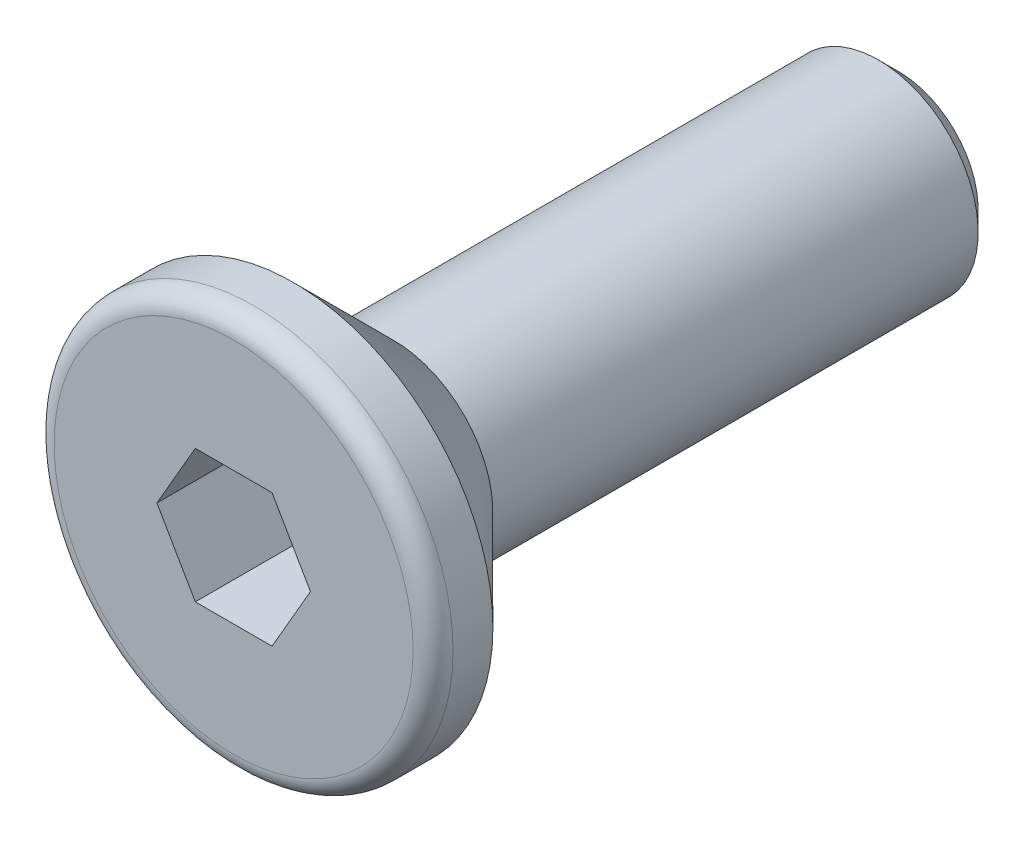
ISO-10303-21;
HEADER;
FILE_DESCRIPTION(('STEP AP214'),'2;1');
FILE_NAME('part.step','',(''),(''),'','','');
FILE_SCHEMA(('AUTOMOTIVE_DESIGN { 1 0 10303 214 1 1 1 1 }'));
ENDSEC;
DATA;
#1=APPLICATION_CONTEXT('core data for automotive mechanical design processes');
#2=APPLICATION_PROTOCOL_DEFINITION('international standard','automotive_design',2000,#1);
#3=PRODUCT_CONTEXT('',#1,'mechanical');
#4=PRODUCT('Part','Part','',(#3));
#5=PRODUCT_RELATED_PRODUCT_CATEGORY('part','',(#4));
#6=PRODUCT_DEFINITION_FORMATION('','',#4);
#7=PRODUCT_DEFINITION_CONTEXT('part definition',#1,'design');
#8=PRODUCT_DEFINITION('design','',#6,#7);
#9=PRODUCT_DEFINITION_SHAPE('','',#8);
#10=(LENGTH_UNIT() NAMED_UNIT(*) SI_UNIT(.MILLI.,.METRE.));
#11=(NAMED_UNIT(*) PLANE_ANGLE_UNIT() SI_UNIT($,.RADIAN.));
#12=(NAMED_UNIT(*) SI_UNIT($,.STERADIAN.) SOLID_ANGLE_UNIT());
#13=UNCERTAINTY_MEASURE_WITH_UNIT(LENGTH_MEASURE(1.E-05),#10,'distance_accuracy_value','');
#14=(GEOMETRIC_REPRESENTATION_CONTEXT(3) GLOBAL_UNCERTAINTY_ASSIGNED_CONTEXT((#13)) GLOBAL_UNIT_ASSIGNED_CONTEXT((#10,
#11,#12)) REPRESENTATION_CONTEXT('',''));
#15=CARTESIAN_POINT('',(0.,0.,0.));
#16=DIRECTION('',(0.,0.,1.));
#17=DIRECTION('',(1.,0.,0.));
#18=AXIS2_PLACEMENT_3D('',#15,#16,#17);
#19=CARTESIAN_POINT('',(0.,0.,5.));
#20=DIRECTION('',(0.,0.,1.));
#21=DIRECTION('',(1.,0.,0.));
#22=AXIS2_PLACEMENT_3D('',#19,#20,#21);
#23=PLANE('',#22);
#24=CARTESIAN_POINT('',(0.,0.,5.));
#25=DIRECTION('',(0.,0.,1.));
#26=DIRECTION('',(1.,0.,0.));
#27=AXIS2_PLACEMENT_3D('',#24,#25,#26);
#28=CIRCLE('',#27,2.7);
#29=CARTESIAN_POINT('',(2.7,0.,5.));
#30=VERTEX_POINT('',#29);
#31=EDGE_CURVE('E11',#30,#30,#28,.T.);
#32=ORIENTED_EDGE('',*,*,#31,.T.);
#33=EDGE_LOOP('',(#32));
#34=FACE_BOUND('',#33,.T.);
#35=DIRECTION('',(0.5,0.866025403784439,0.));
#36=VECTOR('',#35,1.);
#37=CARTESIAN_POINT('',(0.577350269189626,-1.,5.));
#38=LINE('',#37,#36);
#39=CARTESIAN_POINT('',(0.577350269189626,-1.,5.));
#40=VERTEX_POINT('',#39);
#41=CARTESIAN_POINT('',(1.15470053837925,0.,5.));
#42=VERTEX_POINT('',#41);
#43=EDGE_CURVE('E50',#40,#42,#38,.T.);
#44=ORIENTED_EDGE('',*,*,#43,.F.);
#45=DIRECTION('',(1.,0.,0.));
#46=VECTOR('',#45,1.);
#47=CARTESIAN_POINT('',(-0.577350269189626,-1.,5.));
#48=LINE('',#47,#46);
#49=CARTESIAN_POINT('',(-0.577350269189626,-1.,5.));
#50=VERTEX_POINT('',#49);
#51=EDGE_CURVE('E133',#50,#40,#48,.T.);
#52=ORIENTED_EDGE('',*,*,#51,.F.);
#53=DIRECTION('',(0.5,-0.866025403784438,0.));
#54=VECTOR('',#53,1.);
#55=CARTESIAN_POINT('',(-1.15470053837925,0.,5.));
#56=LINE('',#55,#54);
#57=CARTESIAN_POINT('',(-1.15470053837925,0.,5.));
#58=VERTEX_POINT('',#57);
#59=EDGE_CURVE('E131',#58,#50,#56,.T.);
#60=ORIENTED_EDGE('',*,*,#59,.F.);
#61=DIRECTION('',(-0.5,-0.866025403784439,0.));
#62=VECTOR('',#61,1.);
#63=CARTESIAN_POINT('',(-0.577350269189626,1.,5.));
#64=LINE('',#63,#62);
#65=CARTESIAN_POINT('',(-0.577350269189626,1.,5.));
#66=VERTEX_POINT('',#65);
#67=EDGE_CURVE('E98',#66,#58,#64,.T.);
#68=ORIENTED_EDGE('',*,*,#67,.F.);
#69=DIRECTION('',(-1.,0.,0.));
#70=VECTOR('',#69,1.);
#71=CARTESIAN_POINT('',(0.577350269189626,1.,5.));
#72=LINE('',#71,#70);
#73=CARTESIAN_POINT('',(0.577350269189626,1.,5.));
#74=VERTEX_POINT('',#73);
#75=EDGE_CURVE('E127',#74,#66,#72,.T.);
#76=ORIENTED_EDGE('',*,*,#75,.F.);
#77=DIRECTION('',(-0.5,0.866025403784438,0.));
#78=VECTOR('',#77,1.);
#79=CARTESIAN_POINT('',(1.15470053837925,0.,5.));
#80=LINE('',#79,#78);
#81=EDGE_CURVE('E124',#42,#74,#80,.T.);
#82=ORIENTED_EDGE('',*,*,#81,.F.);
#83=EDGE_LOOP('',(#44,#52,#60,#68,#76,#82));
#84=FACE_BOUND('',#83,.T.);
#85=ADVANCED_FACE('F35',(#34,#84),#23,.T.);
#86=CARTESIAN_POINT('',(0.,0.,-5.));
#87=DIRECTION('',(0.,0.,-1.));
#88=DIRECTION('',(-1.,0.,0.));
#89=AXIS2_PLACEMENT_3D('',#86,#87,#88);
#90=CYLINDRICAL_SURFACE('',#89,3.);
#91=CARTESIAN_POINT('',(0.,0.,4.7));
#92=DIRECTION('',(0.,0.,1.));
#93=DIRECTION('',(1.,0.,0.));
#94=AXIS2_PLACEMENT_3D('',#91,#92,#93);
#95=CIRCLE('',#94,3.);
#96=CARTESIAN_POINT('',(3.,0.,4.7));
#97=VERTEX_POINT('',#96);
#98=EDGE_CURVE('E43',#97,#97,#95,.F.);
#99=ORIENTED_EDGE('',*,*,#98,.T.);
#100=EDGE_LOOP('',(#99));
#101=FACE_BOUND('',#100,.T.);
#102=CARTESIAN_POINT('',(0.,0.,4.10000000000002));
#103=DIRECTION('',(0.,0.,-1.));
#104=DIRECTION('',(-1.,0.,0.));
#105=AXIS2_PLACEMENT_3D('',#102,#103,#104);
#106=CIRCLE('',#105,3.);
#107=CARTESIAN_POINT('',(-3.,0.,4.10000000000002));
#108=VERTEX_POINT('',#107);
#109=EDGE_CURVE('E151',#108,#108,#106,.T.);
#110=ORIENTED_EDGE('',*,*,#109,.F.);
#111=EDGE_LOOP('',(#110));
#112=FACE_BOUND('',#111,.T.);
#113=ADVANCED_FACE('F156',(#101,#112),#90,.T.);
#114=CARTESIAN_POINT('',(0.,0.,2.6));
#115=DIRECTION('',(0.,0.,1.));
#116=DIRECTION('',(1.,0.,0.));
#117=AXIS2_PLACEMENT_3D('',#114,#115,#116);
#118=CONICAL_SURFACE('',#117,1.5,0.785398163397443);
#119=ORIENTED_EDGE('',*,*,#109,.T.);
#120=EDGE_LOOP('',(#119));
#121=FACE_BOUND('',#120,.T.);
#122=CARTESIAN_POINT('',(0.,0.,2.6));
#123=DIRECTION('',(0.,0.,-1.));
#124=DIRECTION('',(-1.,0.,0.));
#125=AXIS2_PLACEMENT_3D('',#122,#123,#124);
#126=CIRCLE('',#125,1.5);
#127=CARTESIAN_POINT('',(-1.5,0.,2.6));
#128=VERTEX_POINT('',#127);
#129=EDGE_CURVE('E148',#128,#128,#126,.T.);
#130=ORIENTED_EDGE('',*,*,#129,.F.);
#131=EDGE_LOOP('',(#130));
#132=FACE_BOUND('',#131,.T.);
#133=ADVANCED_FACE('F172',(#121,#132),#118,.T.);
#134=CARTESIAN_POINT('',(0.,0.,-5.));
#135=DIRECTION('',(0.,0.,-1.));
#136=DIRECTION('',(-1.,0.,0.));
#137=AXIS2_PLACEMENT_3D('',#134,#135,#136);
#138=CYLINDRICAL_SURFACE('',#137,1.5);
#139=ORIENTED_EDGE('',*,*,#129,.T.);
#140=EDGE_LOOP('',(#139));
#141=FACE_BOUND('',#140,.T.);
#142=CARTESIAN_POINT('',(0.,0.,-4.7));
#143=DIRECTION('',(0.,0.,-1.));
#144=DIRECTION('',(-1.,0.,0.));
#145=AXIS2_PLACEMENT_3D('',#142,#143,#144);
#146=CIRCLE('',#145,1.5);
#147=CARTESIAN_POINT('',(-1.5,0.,-4.7));
#148=VERTEX_POINT('',#147);
#149=EDGE_CURVE('E145',#148,#148,#146,.T.);
#150=ORIENTED_EDGE('',*,*,#149,.F.);
#151=EDGE_LOOP('',(#150));
#152=FACE_BOUND('',#151,.T.);
#153=ADVANCED_FACE('F178',(#141,#152),#138,.T.);
#154=CARTESIAN_POINT('',(0.,0.,-5.));
#155=DIRECTION('',(0.,0.,1.));
#156=DIRECTION('',(1.,0.,0.));
#157=AXIS2_PLACEMENT_3D('',#154,#155,#156);
#158=CONICAL_SURFACE('',#157,1.2,0.785398163397443);
#159=ORIENTED_EDGE('',*,*,#149,.T.);
#160=EDGE_LOOP('',(#159));
#161=FACE_BOUND('',#160,.T.);
#162=CARTESIAN_POINT('',(0.,0.,-5.));
#163=DIRECTION('',(0.,0.,-1.));
#164=DIRECTION('',(-1.,0.,0.));
#165=AXIS2_PLACEMENT_3D('',#162,#163,#164);
#166=CIRCLE('',#165,1.2);
#167=CARTESIAN_POINT('',(-1.2,0.,-5.));
#168=VERTEX_POINT('',#167);
#169=EDGE_CURVE('E137',#168,#168,#166,.T.);
#170=ORIENTED_EDGE('',*,*,#169,.F.);
#171=EDGE_LOOP('',(#170));
#172=FACE_BOUND('',#171,.T.);
#173=ADVANCED_FACE('F182',(#161,#172),#158,.T.);
#174=CARTESIAN_POINT('',(0.,1.2,-5.));
#175=DIRECTION('',(0.,0.,-1.));
#176=DIRECTION('',(-1.,0.,0.));
#177=AXIS2_PLACEMENT_3D('',#174,#175,#176);
#178=PLANE('',#177);
#179=ORIENTED_EDGE('',*,*,#169,.T.);
#180=EDGE_LOOP('',(#179));
#181=FACE_BOUND('',#180,.T.);
#182=ADVANCED_FACE('F186',(#181),#178,.T.);
#183=CARTESIAN_POINT('',(0.577350269189626,-1.,3.5));
#184=DIRECTION('',(0.866025403784438,-0.5,0.));
#185=DIRECTION('',(0.5,0.866025403784439,0.));
#186=AXIS2_PLACEMENT_3D('',#183,#184,#185);
#187=PLANE('',#186);
#188=ORIENTED_EDGE('',*,*,#43,.T.);
#189=DIRECTION('',(0.,0.,1.));
#190=VECTOR('',#189,1.);
#191=CARTESIAN_POINT('',(1.15470053837925,0.,3.5));
#192=LINE('',#191,#190);
#193=CARTESIAN_POINT('',(1.15470053837925,0.,3.5));
#194=VERTEX_POINT('',#193);
#195=EDGE_CURVE('E80',#194,#42,#192,.T.);
#196=ORIENTED_EDGE('',*,*,#195,.F.);
#197=DIRECTION('',(0.5,0.866025403784439,0.));
#198=VECTOR('',#197,1.);
#199=CARTESIAN_POINT('',(0.577350269189626,-1.,3.5));
#200=LINE('',#199,#198);
#201=CARTESIAN_POINT('',(0.577350269189626,-1.,3.5));
#202=VERTEX_POINT('',#201);
#203=EDGE_CURVE('E135',#202,#194,#200,.T.);
#204=ORIENTED_EDGE('',*,*,#203,.F.);
#205=DIRECTION('',(0.,0.,1.));
#206=VECTOR('',#205,1.);
#207=CARTESIAN_POINT('',(0.577350269189626,-1.,3.5));
#208=LINE('',#207,#206);
#209=EDGE_CURVE('E58',#202,#40,#208,.T.);
#210=ORIENTED_EDGE('',*,*,#209,.T.);
#211=EDGE_LOOP('',(#188,#196,#204,#210));
#212=FACE_BOUND('',#211,.T.);
#213=ADVANCED_FACE('F190',(#212),#187,.F.);
#214=CARTESIAN_POINT('',(-0.577350269189626,-1.,3.5));
#215=DIRECTION('',(0.,-1.,0.));
#216=DIRECTION('',(1.,0.,0.));
#217=AXIS2_PLACEMENT_3D('',#214,#215,#216);
#218=PLANE('',#217);
#219=ORIENTED_EDGE('',*,*,#51,.T.);
#220=ORIENTED_EDGE('',*,*,#209,.F.);
#221=DIRECTION('',(1.,0.,0.));
#222=VECTOR('',#221,1.);
#223=CARTESIAN_POINT('',(-0.577350269189626,-1.,3.5));
#224=LINE('',#223,#222);
#225=CARTESIAN_POINT('',(-0.577350269189626,-1.,3.5));
#226=VERTEX_POINT('',#225);
#227=EDGE_CURVE('E110',#226,#202,#224,.T.);
#228=ORIENTED_EDGE('',*,*,#227,.F.);
#229=DIRECTION('',(0.,0.,1.));
#230=VECTOR('',#229,1.);
#231=CARTESIAN_POINT('',(-0.577350269189626,-1.,3.5));
#232=LINE('',#231,#230);
#233=EDGE_CURVE('E102',#226,#50,#232,.T.);
#234=ORIENTED_EDGE('',*,*,#233,.T.);
#235=EDGE_LOOP('',(#219,#220,#228,#234));
#236=FACE_BOUND('',#235,.T.);
#237=ADVANCED_FACE('F194',(#236),#218,.F.);
#238=CARTESIAN_POINT('',(-1.15470053837925,0.,3.5));
#239=DIRECTION('',(-0.866025403784439,-0.5,0.));
#240=DIRECTION('',(0.5,-0.866025403784439,0.));
#241=AXIS2_PLACEMENT_3D('',#238,#239,#240);
#242=PLANE('',#241);
#243=ORIENTED_EDGE('',*,*,#59,.T.);
#244=ORIENTED_EDGE('',*,*,#233,.F.);
#245=DIRECTION('',(0.5,-0.866025403784438,0.));
#246=VECTOR('',#245,1.);
#247=CARTESIAN_POINT('',(-1.15470053837925,0.,3.5));
#248=LINE('',#247,#246);
#249=CARTESIAN_POINT('',(-1.15470053837925,0.,3.5));
#250=VERTEX_POINT('',#249);
#251=EDGE_CURVE('E106',#250,#226,#248,.T.);
#252=ORIENTED_EDGE('',*,*,#251,.F.);
#253=DIRECTION('',(0.,0.,1.));
#254=VECTOR('',#253,1.);
#255=CARTESIAN_POINT('',(-1.15470053837925,0.,3.5));
#256=LINE('',#255,#254);
#257=EDGE_CURVE('E91',#250,#58,#256,.T.);
#258=ORIENTED_EDGE('',*,*,#257,.T.);
#259=EDGE_LOOP('',(#243,#244,#252,#258));
#260=FACE_BOUND('',#259,.T.);
#261=ADVANCED_FACE('F107',(#260),#242,.F.);
#262=CARTESIAN_POINT('',(-0.577350269189626,1.,3.5));
#263=DIRECTION('',(-0.866025403784439,0.5,0.));
#264=DIRECTION('',(-0.5,-0.866025403784439,0.));
#265=AXIS2_PLACEMENT_3D('',#262,#263,#264);
#266=PLANE('',#265);
#267=ORIENTED_EDGE('',*,*,#67,.T.);
#268=ORIENTED_EDGE('',*,*,#257,.F.);
#269=DIRECTION('',(-0.5,-0.866025403784439,0.));
#270=VECTOR('',#269,1.);
#271=CARTESIAN_POINT('',(-0.577350269189626,1.,3.5));
#272=LINE('',#271,#270);
#273=CARTESIAN_POINT('',(-0.577350269189626,1.,3.5));
#274=VERTEX_POINT('',#273);
#275=EDGE_CURVE('E95',#274,#250,#272,.T.);
#276=ORIENTED_EDGE('',*,*,#275,.F.);
#277=DIRECTION('',(0.,0.,1.));
#278=VECTOR('',#277,1.);
#279=CARTESIAN_POINT('',(-0.577350269189626,1.,3.5));
#280=LINE('',#279,#278);
#281=EDGE_CURVE('E103',#274,#66,#280,.T.);
#282=ORIENTED_EDGE('',*,*,#281,.T.);
#283=EDGE_LOOP('',(#267,#268,#276,#282));
#284=FACE_BOUND('',#283,.T.);
#285=ADVANCED_FACE('F93',(#284),#266,.F.);
#286=CARTESIAN_POINT('',(0.577350269189626,1.,3.5));
#287=DIRECTION('',(0.,1.,0.));
#288=DIRECTION('',(-1.,0.,0.));
#289=AXIS2_PLACEMENT_3D('',#286,#287,#288);
#290=PLANE('',#289);
#291=ORIENTED_EDGE('',*,*,#75,.T.);
#292=ORIENTED_EDGE('',*,*,#281,.F.);
#293=DIRECTION('',(-1.,0.,0.));
#294=VECTOR('',#293,1.);
#295=CARTESIAN_POINT('',(0.577350269189626,1.,3.5));
#296=LINE('',#295,#294);
#297=CARTESIAN_POINT('',(0.577350269189626,1.,3.5));
#298=VERTEX_POINT('',#297);
#299=EDGE_CURVE('E116',#298,#274,#296,.T.);
#300=ORIENTED_EDGE('',*,*,#299,.F.);
#301=DIRECTION('',(0.,0.,1.));
#302=VECTOR('',#301,1.);
#303=CARTESIAN_POINT('',(0.577350269189626,1.,3.5));
#304=LINE('',#303,#302);
#305=EDGE_CURVE('E140',#298,#74,#304,.T.);
#306=ORIENTED_EDGE('',*,*,#305,.T.);
#307=EDGE_LOOP('',(#291,#292,#300,#306));
#308=FACE_BOUND('',#307,.T.);
#309=ADVANCED_FACE('F197',(#308),#290,.F.);
#310=CARTESIAN_POINT('',(1.15470053837925,0.,3.5));
#311=DIRECTION('',(0.866025403784439,0.5,0.));
#312=DIRECTION('',(-0.5,0.866025403784439,0.));
#313=AXIS2_PLACEMENT_3D('',#310,#311,#312);
#314=PLANE('',#313);
#315=ORIENTED_EDGE('',*,*,#81,.T.);
#316=ORIENTED_EDGE('',*,*,#305,.F.);
#317=DIRECTION('',(-0.5,0.866025403784438,0.));
#318=VECTOR('',#317,1.);
#319=CARTESIAN_POINT('',(1.15470053837925,0.,3.5));
#320=LINE('',#319,#318);
#321=EDGE_CURVE('E118',#194,#298,#320,.T.);
#322=ORIENTED_EDGE('',*,*,#321,.F.);
#323=ORIENTED_EDGE('',*,*,#195,.T.);
#324=EDGE_LOOP('',(#315,#316,#322,#323));
#325=FACE_BOUND('',#324,.T.);
#326=ADVANCED_FACE('F164',(#325),#314,.F.);
#327=CARTESIAN_POINT('',(0.,0.,3.5));
#328=DIRECTION('',(0.,0.,1.));
#329=DIRECTION('',(1.,0.,0.));
#330=AXIS2_PLACEMENT_3D('',#327,#328,#329);
#331=PLANE('',#330);
#332=ORIENTED_EDGE('',*,*,#203,.T.);
#333=ORIENTED_EDGE('',*,*,#321,.T.);
#334=ORIENTED_EDGE('',*,*,#299,.T.);
#335=ORIENTED_EDGE('',*,*,#275,.T.);
#336=ORIENTED_EDGE('',*,*,#251,.T.);
#337=ORIENTED_EDGE('',*,*,#227,.T.);
#338=EDGE_LOOP('',(#332,#333,#334,#335,#336,#337));
#339=FACE_BOUND('',#338,.T.);
#340=ADVANCED_FACE('F113',(#339),#331,.T.);
#341=CARTESIAN_POINT('',(0.,0.,4.7));
#342=DIRECTION('',(0.,0.,1.));
#343=DIRECTION('',(1.,0.,0.));
#344=AXIS2_PLACEMENT_3D('',#341,#342,#343);
#345=TOROIDAL_SURFACE('',#344,2.7,0.3);
#346=ORIENTED_EDGE('',*,*,#31,.F.);
#347=EDGE_LOOP('',(#346));
#348=FACE_BOUND('',#347,.T.);
#349=ORIENTED_EDGE('',*,*,#98,.F.);
#350=EDGE_LOOP('',(#349));
#351=FACE_BOUND('',#350,.T.);
#352=ADVANCED_FACE('F37',(#348,#351),#345,.T.);
#353=CLOSED_SHELL('',(#85,#113,#133,#153,#173,#182,#213,#237,#261,#285,#309,#326,#340,#352));
#354=MANIFOLD_SOLID_BREP('B2',#353);
#355=ADVANCED_BREP_SHAPE_REPRESENTATION('',(#18,#354),#14);
#356=SHAPE_DEFINITION_REPRESENTATION(#9,#355);
ENDSEC;
END-ISO-10303-21;
